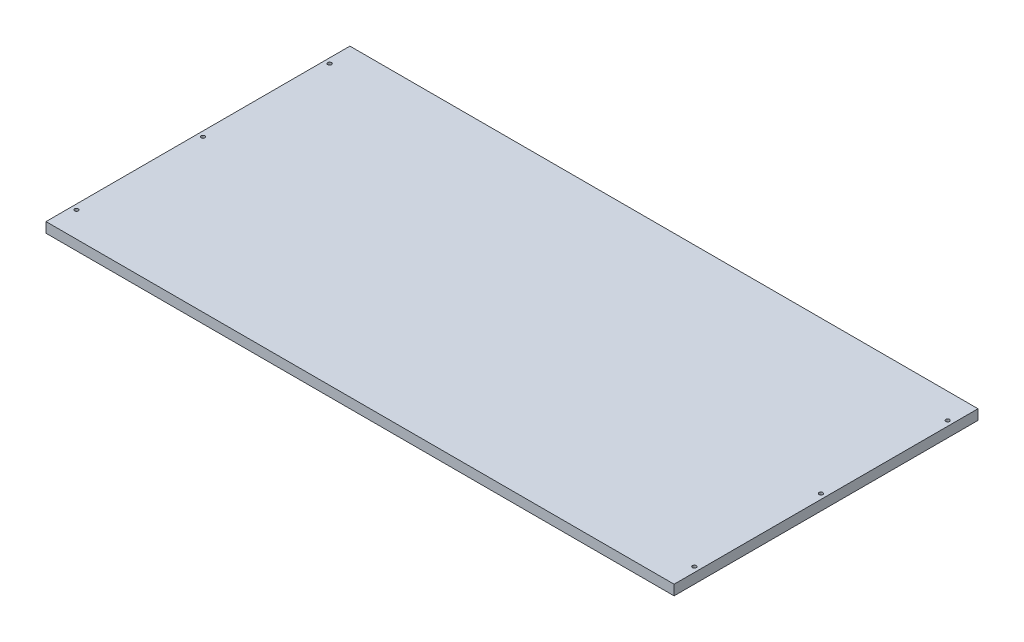
ISO-10303-21;
HEADER;
FILE_DESCRIPTION(('STEP AP214'),'2;1');
FILE_NAME('part.step','',(''),(''),'','','');
FILE_SCHEMA(('AUTOMOTIVE_DESIGN { 1 0 10303 214 1 1 1 1 }'));
ENDSEC;
DATA;
#1=APPLICATION_CONTEXT('core data for automotive mechanical design processes');
#2=APPLICATION_PROTOCOL_DEFINITION('international standard','automotive_design',2000,#1);
#3=PRODUCT_CONTEXT('',#1,'mechanical');
#4=PRODUCT('Part','Part','',(#3));
#5=PRODUCT_RELATED_PRODUCT_CATEGORY('part','',(#4));
#6=PRODUCT_DEFINITION_FORMATION('','',#4);
#7=PRODUCT_DEFINITION_CONTEXT('part definition',#1,'design');
#8=PRODUCT_DEFINITION('design','',#6,#7);
#9=PRODUCT_DEFINITION_SHAPE('','',#8);
#10=(LENGTH_UNIT() NAMED_UNIT(*) SI_UNIT(.MILLI.,.METRE.));
#11=(NAMED_UNIT(*) PLANE_ANGLE_UNIT() SI_UNIT($,.RADIAN.));
#12=(NAMED_UNIT(*) SI_UNIT($,.STERADIAN.) SOLID_ANGLE_UNIT());
#13=UNCERTAINTY_MEASURE_WITH_UNIT(LENGTH_MEASURE(1.E-05),#10,'distance_accuracy_value','');
#14=(GEOMETRIC_REPRESENTATION_CONTEXT(3) GLOBAL_UNCERTAINTY_ASSIGNED_CONTEXT((#13)) GLOBAL_UNIT_ASSIGNED_CONTEXT((#10,
#11,#12)) REPRESENTATION_CONTEXT('',''));
#15=CARTESIAN_POINT('',(0.,0.,0.));
#16=DIRECTION('',(0.,0.,1.));
#17=DIRECTION('',(1.,0.,0.));
#18=AXIS2_PLACEMENT_3D('',#15,#16,#17);
#19=CARTESIAN_POINT('',(0.,6.,0.));
#20=DIRECTION('',(0.,1.,0.));
#21=DIRECTION('',(0.,0.,1.));
#22=AXIS2_PLACEMENT_3D('',#19,#20,#21);
#23=PLANE('',#22);
#24=CARTESIAN_POINT('',(-369.,6.,-90.));
#25=DIRECTION('',(0.,1.,0.));
#26=DIRECTION('',(0.,0.,1.));
#27=AXIS2_PLACEMENT_3D('',#24,#25,#26);
#28=CIRCLE('',#27,1.09999999999999);
#29=CARTESIAN_POINT('',(-369.,6.,-88.9));
#30=VERTEX_POINT('',#29);
#31=EDGE_CURVE('E135',#30,#30,#28,.T.);
#32=ORIENTED_EDGE('',*,*,#31,.F.);
#33=EDGE_LOOP('',(#32));
#34=FACE_BOUND('',#33,.T.);
#35=CARTESIAN_POINT('',(-3.,6.,-165.));
#36=DIRECTION('',(0.,1.,0.));
#37=DIRECTION('',(0.,0.,1.));
#38=AXIS2_PLACEMENT_3D('',#35,#36,#37);
#39=CIRCLE('',#38,1.09999999999999);
#40=CARTESIAN_POINT('',(-3.,6.,-163.9));
#41=VERTEX_POINT('',#40);
#42=EDGE_CURVE('E123',#41,#41,#39,.T.);
#43=ORIENTED_EDGE('',*,*,#42,.F.);
#44=EDGE_LOOP('',(#43));
#45=FACE_BOUND('',#44,.T.);
#46=CARTESIAN_POINT('',(-369.,6.,-165.));
#47=DIRECTION('',(0.,1.,0.));
#48=DIRECTION('',(0.,0.,1.));
#49=AXIS2_PLACEMENT_3D('',#46,#47,#48);
#50=CIRCLE('',#49,1.09999999999999);
#51=CARTESIAN_POINT('',(-369.,6.,-163.9));
#52=VERTEX_POINT('',#51);
#53=EDGE_CURVE('E102',#52,#52,#50,.T.);
#54=ORIENTED_EDGE('',*,*,#53,.F.);
#55=EDGE_LOOP('',(#54));
#56=FACE_BOUND('',#55,.T.);
#57=DIRECTION('',(0.,0.,1.));
#58=VECTOR('',#57,1.);
#59=CARTESIAN_POINT('',(-372.,6.,-180.));
#60=LINE('',#59,#58);
#61=CARTESIAN_POINT('',(-372.,6.,-180.));
#62=VERTEX_POINT('',#61);
#63=CARTESIAN_POINT('',(-372.,6.,0.));
#64=VERTEX_POINT('',#63);
#65=EDGE_CURVE('E87',#62,#64,#60,.T.);
#66=ORIENTED_EDGE('',*,*,#65,.T.);
#67=DIRECTION('',(1.,0.,0.));
#68=VECTOR('',#67,1.);
#69=CARTESIAN_POINT('',(-372.,6.,0.));
#70=LINE('',#69,#68);
#71=CARTESIAN_POINT('',(0.,6.,0.));
#72=VERTEX_POINT('',#71);
#73=EDGE_CURVE('E82',#64,#72,#70,.T.);
#74=ORIENTED_EDGE('',*,*,#73,.T.);
#75=DIRECTION('',(0.,0.,-1.));
#76=VECTOR('',#75,1.);
#77=CARTESIAN_POINT('',(0.,6.,-180.));
#78=LINE('',#77,#76);
#79=CARTESIAN_POINT('',(0.,6.,-180.));
#80=VERTEX_POINT('',#79);
#81=EDGE_CURVE('E85',#72,#80,#78,.T.);
#82=ORIENTED_EDGE('',*,*,#81,.T.);
#83=DIRECTION('',(-1.,0.,0.));
#84=VECTOR('',#83,1.);
#85=CARTESIAN_POINT('',(-372.,6.,-180.));
#86=LINE('',#85,#84);
#87=EDGE_CURVE('E52',#80,#62,#86,.T.);
#88=ORIENTED_EDGE('',*,*,#87,.T.);
#89=EDGE_LOOP('',(#66,#74,#82,#88));
#90=FACE_BOUND('',#89,.T.);
#91=CARTESIAN_POINT('',(-369.,6.,-15.));
#92=DIRECTION('',(0.,1.,0.));
#93=DIRECTION('',(0.,0.,1.));
#94=AXIS2_PLACEMENT_3D('',#91,#92,#93);
#95=CIRCLE('',#94,1.09999999999999);
#96=CARTESIAN_POINT('',(-369.,6.,-13.9));
#97=VERTEX_POINT('',#96);
#98=EDGE_CURVE('E117',#97,#97,#95,.T.);
#99=ORIENTED_EDGE('',*,*,#98,.F.);
#100=EDGE_LOOP('',(#99));
#101=FACE_BOUND('',#100,.T.);
#102=CARTESIAN_POINT('',(-3.,6.,-15.));
#103=DIRECTION('',(0.,1.,0.));
#104=DIRECTION('',(0.,0.,1.));
#105=AXIS2_PLACEMENT_3D('',#102,#103,#104);
#106=CIRCLE('',#105,1.1);
#107=CARTESIAN_POINT('',(-3.,6.,-13.9));
#108=VERTEX_POINT('',#107);
#109=EDGE_CURVE('E129',#108,#108,#106,.T.);
#110=ORIENTED_EDGE('',*,*,#109,.F.);
#111=EDGE_LOOP('',(#110));
#112=FACE_BOUND('',#111,.T.);
#113=CARTESIAN_POINT('',(-3.,6.,-90.));
#114=DIRECTION('',(0.,1.,0.));
#115=DIRECTION('',(0.,0.,1.));
#116=AXIS2_PLACEMENT_3D('',#113,#114,#115);
#117=CIRCLE('',#116,1.1);
#118=CARTESIAN_POINT('',(-3.,6.,-88.9));
#119=VERTEX_POINT('',#118);
#120=EDGE_CURVE('E141',#119,#119,#117,.T.);
#121=ORIENTED_EDGE('',*,*,#120,.F.);
#122=EDGE_LOOP('',(#121));
#123=FACE_BOUND('',#122,.T.);
#124=ADVANCED_FACE('F35',(#34,#45,#56,#90,#101,#112,#123),#23,.T.);
#125=CARTESIAN_POINT('',(0.,0.,0.));
#126=DIRECTION('',(0.,1.,0.));
#127=DIRECTION('',(0.,0.,1.));
#128=AXIS2_PLACEMENT_3D('',#125,#126,#127);
#129=PLANE('',#128);
#130=CARTESIAN_POINT('',(-369.,0.,-90.));
#131=DIRECTION('',(0.,1.,0.));
#132=DIRECTION('',(0.,0.,1.));
#133=AXIS2_PLACEMENT_3D('',#130,#131,#132);
#134=CIRCLE('',#133,1.09999999999999);
#135=CARTESIAN_POINT('',(-369.,0.,-88.9));
#136=VERTEX_POINT('',#135);
#137=EDGE_CURVE('E138',#136,#136,#134,.T.);
#138=ORIENTED_EDGE('',*,*,#137,.T.);
#139=EDGE_LOOP('',(#138));
#140=FACE_BOUND('',#139,.T.);
#141=CARTESIAN_POINT('',(-3.,0.,-165.));
#142=DIRECTION('',(0.,1.,0.));
#143=DIRECTION('',(0.,0.,1.));
#144=AXIS2_PLACEMENT_3D('',#141,#142,#143);
#145=CIRCLE('',#144,1.09999999999999);
#146=CARTESIAN_POINT('',(-3.,0.,-163.9));
#147=VERTEX_POINT('',#146);
#148=EDGE_CURVE('E126',#147,#147,#145,.T.);
#149=ORIENTED_EDGE('',*,*,#148,.T.);
#150=EDGE_LOOP('',(#149));
#151=FACE_BOUND('',#150,.T.);
#152=CARTESIAN_POINT('',(-369.,0.,-165.));
#153=DIRECTION('',(0.,1.,0.));
#154=DIRECTION('',(0.,0.,1.));
#155=AXIS2_PLACEMENT_3D('',#152,#153,#154);
#156=CIRCLE('',#155,1.09999999999999);
#157=CARTESIAN_POINT('',(-369.,0.,-163.9));
#158=VERTEX_POINT('',#157);
#159=EDGE_CURVE('E114',#158,#158,#156,.T.);
#160=ORIENTED_EDGE('',*,*,#159,.T.);
#161=EDGE_LOOP('',(#160));
#162=FACE_BOUND('',#161,.T.);
#163=DIRECTION('',(0.,0.,1.));
#164=VECTOR('',#163,1.);
#165=CARTESIAN_POINT('',(-372.,0.,-180.));
#166=LINE('',#165,#164);
#167=CARTESIAN_POINT('',(-372.,0.,-180.));
#168=VERTEX_POINT('',#167);
#169=CARTESIAN_POINT('',(-372.,0.,0.));
#170=VERTEX_POINT('',#169);
#171=EDGE_CURVE('E99',#168,#170,#166,.T.);
#172=ORIENTED_EDGE('',*,*,#171,.F.);
#173=DIRECTION('',(-1.,0.,0.));
#174=VECTOR('',#173,1.);
#175=CARTESIAN_POINT('',(-372.,0.,-180.));
#176=LINE('',#175,#174);
#177=CARTESIAN_POINT('',(0.,0.,-180.));
#178=VERTEX_POINT('',#177);
#179=EDGE_CURVE('E75',#178,#168,#176,.T.);
#180=ORIENTED_EDGE('',*,*,#179,.F.);
#181=DIRECTION('',(0.,0.,-1.));
#182=VECTOR('',#181,1.);
#183=CARTESIAN_POINT('',(0.,0.,-180.));
#184=LINE('',#183,#182);
#185=CARTESIAN_POINT('',(0.,0.,0.));
#186=VERTEX_POINT('',#185);
#187=EDGE_CURVE('E69',#186,#178,#184,.T.);
#188=ORIENTED_EDGE('',*,*,#187,.F.);
#189=DIRECTION('',(1.,0.,0.));
#190=VECTOR('',#189,1.);
#191=CARTESIAN_POINT('',(-372.,0.,0.));
#192=LINE('',#191,#190);
#193=EDGE_CURVE('E91',#170,#186,#192,.T.);
#194=ORIENTED_EDGE('',*,*,#193,.F.);
#195=EDGE_LOOP('',(#172,#180,#188,#194));
#196=FACE_BOUND('',#195,.T.);
#197=CARTESIAN_POINT('',(-369.,0.,-15.));
#198=DIRECTION('',(0.,1.,0.));
#199=DIRECTION('',(0.,0.,1.));
#200=AXIS2_PLACEMENT_3D('',#197,#198,#199);
#201=CIRCLE('',#200,1.09999999999999);
#202=CARTESIAN_POINT('',(-369.,0.,-13.9));
#203=VERTEX_POINT('',#202);
#204=EDGE_CURVE('E120',#203,#203,#201,.T.);
#205=ORIENTED_EDGE('',*,*,#204,.T.);
#206=EDGE_LOOP('',(#205));
#207=FACE_BOUND('',#206,.T.);
#208=CARTESIAN_POINT('',(-3.,0.,-15.));
#209=DIRECTION('',(0.,1.,0.));
#210=DIRECTION('',(0.,0.,1.));
#211=AXIS2_PLACEMENT_3D('',#208,#209,#210);
#212=CIRCLE('',#211,1.1);
#213=CARTESIAN_POINT('',(-3.,0.,-13.9));
#214=VERTEX_POINT('',#213);
#215=EDGE_CURVE('E132',#214,#214,#212,.T.);
#216=ORIENTED_EDGE('',*,*,#215,.T.);
#217=EDGE_LOOP('',(#216));
#218=FACE_BOUND('',#217,.T.);
#219=CARTESIAN_POINT('',(-3.,0.,-90.));
#220=DIRECTION('',(0.,1.,0.));
#221=DIRECTION('',(0.,0.,1.));
#222=AXIS2_PLACEMENT_3D('',#219,#220,#221);
#223=CIRCLE('',#222,1.1);
#224=CARTESIAN_POINT('',(-3.,0.,-88.9));
#225=VERTEX_POINT('',#224);
#226=EDGE_CURVE('E144',#225,#225,#223,.T.);
#227=ORIENTED_EDGE('',*,*,#226,.T.);
#228=EDGE_LOOP('',(#227));
#229=FACE_BOUND('',#228,.T.);
#230=ADVANCED_FACE('F110',(#140,#151,#162,#196,#207,#218,#229),#129,.F.);
#231=CARTESIAN_POINT('',(-372.,6.,-180.));
#232=DIRECTION('',(1.,0.,0.));
#233=DIRECTION('',(0.,0.,-1.));
#234=AXIS2_PLACEMENT_3D('',#231,#232,#233);
#235=PLANE('',#234);
#236=ORIENTED_EDGE('',*,*,#171,.T.);
#237=DIRECTION('',(0.,-1.,0.));
#238=VECTOR('',#237,1.);
#239=CARTESIAN_POINT('',(-372.,6.,0.));
#240=LINE('',#239,#238);
#241=EDGE_CURVE('E11',#64,#170,#240,.T.);
#242=ORIENTED_EDGE('',*,*,#241,.F.);
#243=ORIENTED_EDGE('',*,*,#65,.F.);
#244=DIRECTION('',(0.,-1.,0.));
#245=VECTOR('',#244,1.);
#246=CARTESIAN_POINT('',(-372.,6.,-180.));
#247=LINE('',#246,#245);
#248=EDGE_CURVE('E95',#62,#168,#247,.T.);
#249=ORIENTED_EDGE('',*,*,#248,.T.);
#250=EDGE_LOOP('',(#236,#242,#243,#249));
#251=FACE_BOUND('',#250,.T.);
#252=ADVANCED_FACE('F37',(#251),#235,.F.);
#253=CARTESIAN_POINT('',(-372.,6.,0.));
#254=DIRECTION('',(0.,0.,-1.));
#255=DIRECTION('',(-1.,0.,0.));
#256=AXIS2_PLACEMENT_3D('',#253,#254,#255);
#257=PLANE('',#256);
#258=ORIENTED_EDGE('',*,*,#193,.T.);
#259=DIRECTION('',(0.,-1.,0.));
#260=VECTOR('',#259,1.);
#261=CARTESIAN_POINT('',(0.,6.,0.));
#262=LINE('',#261,#260);
#263=EDGE_CURVE('E44',#72,#186,#262,.T.);
#264=ORIENTED_EDGE('',*,*,#263,.F.);
#265=ORIENTED_EDGE('',*,*,#73,.F.);
#266=ORIENTED_EDGE('',*,*,#241,.T.);
#267=EDGE_LOOP('',(#258,#264,#265,#266));
#268=FACE_BOUND('',#267,.T.);
#269=ADVANCED_FACE('F90',(#268),#257,.F.);
#270=CARTESIAN_POINT('',(0.,6.,-180.));
#271=DIRECTION('',(-1.,0.,0.));
#272=DIRECTION('',(0.,0.,1.));
#273=AXIS2_PLACEMENT_3D('',#270,#271,#272);
#274=PLANE('',#273);
#275=ORIENTED_EDGE('',*,*,#187,.T.);
#276=DIRECTION('',(0.,-1.,0.));
#277=VECTOR('',#276,1.);
#278=CARTESIAN_POINT('',(0.,6.,-180.));
#279=LINE('',#278,#277);
#280=EDGE_CURVE('E92',#80,#178,#279,.T.);
#281=ORIENTED_EDGE('',*,*,#280,.F.);
#282=ORIENTED_EDGE('',*,*,#81,.F.);
#283=ORIENTED_EDGE('',*,*,#263,.T.);
#284=EDGE_LOOP('',(#275,#281,#282,#283));
#285=FACE_BOUND('',#284,.T.);
#286=ADVANCED_FACE('F93',(#285),#274,.F.);
#287=CARTESIAN_POINT('',(-372.,6.,-180.));
#288=DIRECTION('',(0.,0.,1.));
#289=DIRECTION('',(1.,0.,0.));
#290=AXIS2_PLACEMENT_3D('',#287,#288,#289);
#291=PLANE('',#290);
#292=ORIENTED_EDGE('',*,*,#179,.T.);
#293=ORIENTED_EDGE('',*,*,#248,.F.);
#294=ORIENTED_EDGE('',*,*,#87,.F.);
#295=ORIENTED_EDGE('',*,*,#280,.T.);
#296=EDGE_LOOP('',(#292,#293,#294,#295));
#297=FACE_BOUND('',#296,.T.);
#298=ADVANCED_FACE('F107',(#297),#291,.F.);
#299=CARTESIAN_POINT('',(-369.,6.,-165.));
#300=DIRECTION('',(0.,-1.,0.));
#301=DIRECTION('',(0.,0.,-1.));
#302=AXIS2_PLACEMENT_3D('',#299,#300,#301);
#303=CYLINDRICAL_SURFACE('',#302,1.09999999999999);
#304=ORIENTED_EDGE('',*,*,#53,.T.);
#305=EDGE_LOOP('',(#304));
#306=FACE_BOUND('',#305,.T.);
#307=ORIENTED_EDGE('',*,*,#159,.F.);
#308=EDGE_LOOP('',(#307));
#309=FACE_BOUND('',#308,.T.);
#310=ADVANCED_FACE('F164',(#306,#309),#303,.F.);
#311=CARTESIAN_POINT('',(-369.,6.,-15.));
#312=DIRECTION('',(0.,-1.,0.));
#313=DIRECTION('',(0.,0.,-1.));
#314=AXIS2_PLACEMENT_3D('',#311,#312,#313);
#315=CYLINDRICAL_SURFACE('',#314,1.09999999999999);
#316=ORIENTED_EDGE('',*,*,#98,.T.);
#317=EDGE_LOOP('',(#316));
#318=FACE_BOUND('',#317,.T.);
#319=ORIENTED_EDGE('',*,*,#204,.F.);
#320=EDGE_LOOP('',(#319));
#321=FACE_BOUND('',#320,.T.);
#322=ADVANCED_FACE('F210',(#318,#321),#315,.F.);
#323=CARTESIAN_POINT('',(-3.,6.,-165.));
#324=DIRECTION('',(0.,-1.,0.));
#325=DIRECTION('',(0.,0.,-1.));
#326=AXIS2_PLACEMENT_3D('',#323,#324,#325);
#327=CYLINDRICAL_SURFACE('',#326,1.09999999999999);
#328=ORIENTED_EDGE('',*,*,#42,.T.);
#329=EDGE_LOOP('',(#328));
#330=FACE_BOUND('',#329,.T.);
#331=ORIENTED_EDGE('',*,*,#148,.F.);
#332=EDGE_LOOP('',(#331));
#333=FACE_BOUND('',#332,.T.);
#334=ADVANCED_FACE('F218',(#330,#333),#327,.F.);
#335=CARTESIAN_POINT('',(-3.,6.,-15.));
#336=DIRECTION('',(0.,-1.,0.));
#337=DIRECTION('',(0.,0.,-1.));
#338=AXIS2_PLACEMENT_3D('',#335,#336,#337);
#339=CYLINDRICAL_SURFACE('',#338,1.1);
#340=ORIENTED_EDGE('',*,*,#109,.T.);
#341=EDGE_LOOP('',(#340));
#342=FACE_BOUND('',#341,.T.);
#343=ORIENTED_EDGE('',*,*,#215,.F.);
#344=EDGE_LOOP('',(#343));
#345=FACE_BOUND('',#344,.T.);
#346=ADVANCED_FACE('F226',(#342,#345),#339,.F.);
#347=CARTESIAN_POINT('',(-369.,6.,-90.));
#348=DIRECTION('',(0.,-1.,0.));
#349=DIRECTION('',(0.,0.,-1.));
#350=AXIS2_PLACEMENT_3D('',#347,#348,#349);
#351=CYLINDRICAL_SURFACE('',#350,1.09999999999999);
#352=ORIENTED_EDGE('',*,*,#31,.T.);
#353=EDGE_LOOP('',(#352));
#354=FACE_BOUND('',#353,.T.);
#355=ORIENTED_EDGE('',*,*,#137,.F.);
#356=EDGE_LOOP('',(#355));
#357=FACE_BOUND('',#356,.T.);
#358=ADVANCED_FACE('F235',(#354,#357),#351,.F.);
#359=CARTESIAN_POINT('',(-3.,6.,-90.));
#360=DIRECTION('',(0.,-1.,0.));
#361=DIRECTION('',(0.,0.,-1.));
#362=AXIS2_PLACEMENT_3D('',#359,#360,#361);
#363=CYLINDRICAL_SURFACE('',#362,1.1);
#364=ORIENTED_EDGE('',*,*,#120,.T.);
#365=EDGE_LOOP('',(#364));
#366=FACE_BOUND('',#365,.T.);
#367=ORIENTED_EDGE('',*,*,#226,.F.);
#368=EDGE_LOOP('',(#367));
#369=FACE_BOUND('',#368,.T.);
#370=ADVANCED_FACE('F150',(#366,#369),#363,.F.);
#371=CLOSED_SHELL('',(#124,#230,#252,#269,#286,#298,#310,#322,#334,#346,#358,#370));
#372=MANIFOLD_SOLID_BREP('B2',#371);
#373=ADVANCED_BREP_SHAPE_REPRESENTATION('',(#18,#372),#14);
#374=SHAPE_DEFINITION_REPRESENTATION(#9,#373);
ENDSEC;
END-ISO-10303-21;
